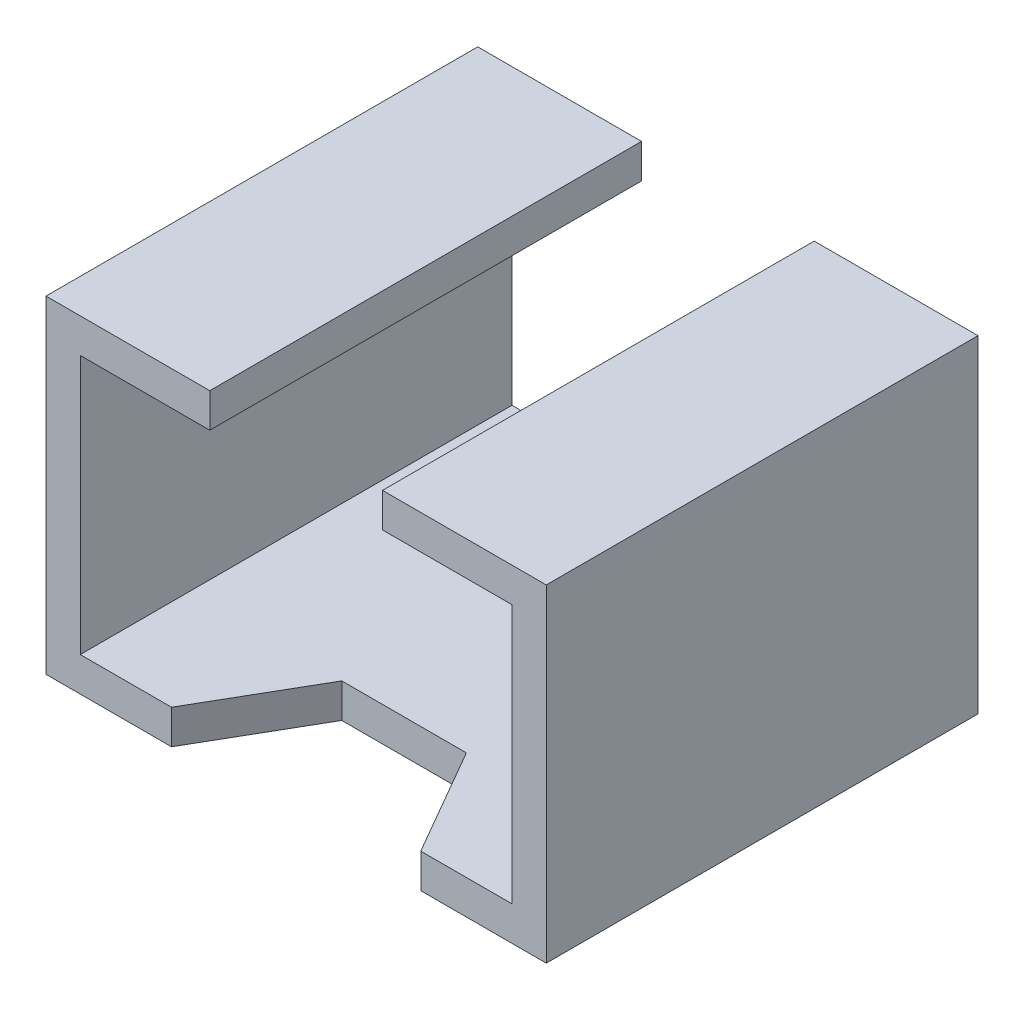
ISO-10303-21;
HEADER;
FILE_DESCRIPTION(('STEP AP214'),'2;1');
FILE_NAME('part.step','',(''),(''),'','','');
FILE_SCHEMA(('AUTOMOTIVE_DESIGN { 1 0 10303 214 1 1 1 1 }'));
ENDSEC;
DATA;
#1=APPLICATION_CONTEXT('core data for automotive mechanical design processes');
#2=APPLICATION_PROTOCOL_DEFINITION('international standard','automotive_design',2000,#1);
#3=PRODUCT_CONTEXT('',#1,'mechanical');
#4=PRODUCT('Part','Part','',(#3));
#5=PRODUCT_RELATED_PRODUCT_CATEGORY('part','',(#4));
#6=PRODUCT_DEFINITION_FORMATION('','',#4);
#7=PRODUCT_DEFINITION_CONTEXT('part definition',#1,'design');
#8=PRODUCT_DEFINITION('design','',#6,#7);
#9=PRODUCT_DEFINITION_SHAPE('','',#8);
#10=(LENGTH_UNIT() NAMED_UNIT(*) SI_UNIT(.MILLI.,.METRE.));
#11=(NAMED_UNIT(*) PLANE_ANGLE_UNIT() SI_UNIT($,.RADIAN.));
#12=(NAMED_UNIT(*) SI_UNIT($,.STERADIAN.) SOLID_ANGLE_UNIT());
#13=UNCERTAINTY_MEASURE_WITH_UNIT(LENGTH_MEASURE(1.E-05),#10,'distance_accuracy_value','');
#14=(GEOMETRIC_REPRESENTATION_CONTEXT(3) GLOBAL_UNCERTAINTY_ASSIGNED_CONTEXT((#13)) GLOBAL_UNIT_ASSIGNED_CONTEXT((#10,
#11,#12)) REPRESENTATION_CONTEXT('',''));
#15=CARTESIAN_POINT('',(0.,0.,0.));
#16=DIRECTION('',(0.,0.,1.));
#17=DIRECTION('',(1.,0.,0.));
#18=AXIS2_PLACEMENT_3D('',#15,#16,#17);
#19=CARTESIAN_POINT('',(0.,0.,50.));
#20=DIRECTION('',(0.,0.,-1.));
#21=DIRECTION('',(-1.,0.,0.));
#22=AXIS2_PLACEMENT_3D('',#19,#20,#21);
#23=PLANE('',#22);
#24=DIRECTION('',(1.,0.,0.));
#25=VECTOR('',#24,1.);
#26=CARTESIAN_POINT('',(-57.9375,-7.9375,50.));
#27=LINE('',#26,#25);
#28=CARTESIAN_POINT('',(-57.9375,-7.9375,50.));
#29=VERTEX_POINT('',#28);
#30=CARTESIAN_POINT('',(-28.8675134594813,-7.9375,50.));
#31=VERTEX_POINT('',#30);
#32=EDGE_CURVE('E303',#29,#31,#27,.T.);
#33=ORIENTED_EDGE('',*,*,#32,.T.);
#34=DIRECTION('',(0.,1.,0.));
#35=VECTOR('',#34,1.);
#36=CARTESIAN_POINT('',(-28.8675134594813,0.,50.));
#37=LINE('',#36,#35);
#38=CARTESIAN_POINT('',(-28.8675134594813,0.,50.));
#39=VERTEX_POINT('',#38);
#40=EDGE_CURVE('E257',#31,#39,#37,.T.);
#41=ORIENTED_EDGE('',*,*,#40,.T.);
#42=DIRECTION('',(-1.,0.,0.));
#43=VECTOR('',#42,1.);
#44=CARTESIAN_POINT('',(-50.,0.,50.));
#45=LINE('',#44,#43);
#46=CARTESIAN_POINT('',(-50.,0.,50.));
#47=VERTEX_POINT('',#46);
#48=EDGE_CURVE('E316',#39,#47,#45,.T.);
#49=ORIENTED_EDGE('',*,*,#48,.T.);
#50=DIRECTION('',(0.,1.,0.));
#51=VECTOR('',#50,1.);
#52=CARTESIAN_POINT('',(-50.,0.,50.));
#53=LINE('',#52,#51);
#54=CARTESIAN_POINT('',(-50.,60.,50.));
#55=VERTEX_POINT('',#54);
#56=EDGE_CURVE('E219',#47,#55,#53,.T.);
#57=ORIENTED_EDGE('',*,*,#56,.T.);
#58=DIRECTION('',(1.,0.,0.));
#59=VECTOR('',#58,1.);
#60=CARTESIAN_POINT('',(-50.,60.,50.));
#61=LINE('',#60,#59);
#62=CARTESIAN_POINT('',(-20.,60.,50.));
#63=VERTEX_POINT('',#62);
#64=EDGE_CURVE('E294',#55,#63,#61,.T.);
#65=ORIENTED_EDGE('',*,*,#64,.T.);
#66=DIRECTION('',(0.,1.,0.));
#67=VECTOR('',#66,1.);
#68=CARTESIAN_POINT('',(-20.,60.,50.));
#69=LINE('',#68,#67);
#70=CARTESIAN_POINT('',(-20.,67.9375,50.));
#71=VERTEX_POINT('',#70);
#72=EDGE_CURVE('E296',#63,#71,#69,.T.);
#73=ORIENTED_EDGE('',*,*,#72,.T.);
#74=DIRECTION('',(-1.,0.,0.));
#75=VECTOR('',#74,1.);
#76=CARTESIAN_POINT('',(-57.9375,67.9375,50.));
#77=LINE('',#76,#75);
#78=CARTESIAN_POINT('',(-57.9375,67.9375,50.));
#79=VERTEX_POINT('',#78);
#80=EDGE_CURVE('E298',#71,#79,#77,.T.);
#81=ORIENTED_EDGE('',*,*,#80,.T.);
#82=DIRECTION('',(0.,-1.,0.));
#83=VECTOR('',#82,1.);
#84=CARTESIAN_POINT('',(-57.9375,-7.9375,50.));
#85=LINE('',#84,#83);
#86=EDGE_CURVE('E300',#79,#29,#85,.T.);
#87=ORIENTED_EDGE('',*,*,#86,.T.);
#88=EDGE_LOOP('',(#33,#41,#49,#57,#65,#73,#81,#87));
#89=FACE_BOUND('',#88,.T.);
#90=ADVANCED_FACE('F33',(#89),#23,.F.);
#91=CARTESIAN_POINT('',(0.,0.,-50.));
#92=DIRECTION('',(0.,0.,-1.));
#93=DIRECTION('',(-1.,0.,0.));
#94=AXIS2_PLACEMENT_3D('',#91,#92,#93);
#95=PLANE('',#94);
#96=DIRECTION('',(0.,1.,0.));
#97=VECTOR('',#96,1.);
#98=CARTESIAN_POINT('',(-28.8675134594813,0.,-50.));
#99=LINE('',#98,#97);
#100=CARTESIAN_POINT('',(-28.8675134594813,-7.9375,-50.));
#101=VERTEX_POINT('',#100);
#102=CARTESIAN_POINT('',(-28.8675134594813,0.,-50.));
#103=VERTEX_POINT('',#102);
#104=EDGE_CURVE('E173',#101,#103,#99,.T.);
#105=ORIENTED_EDGE('',*,*,#104,.F.);
#106=DIRECTION('',(1.,0.,0.));
#107=VECTOR('',#106,1.);
#108=CARTESIAN_POINT('',(-57.9375,-7.9375,-50.));
#109=LINE('',#108,#107);
#110=CARTESIAN_POINT('',(-57.9375,-7.9375,-50.));
#111=VERTEX_POINT('',#110);
#112=EDGE_CURVE('E189',#111,#101,#109,.T.);
#113=ORIENTED_EDGE('',*,*,#112,.F.);
#114=DIRECTION('',(0.,-1.,0.));
#115=VECTOR('',#114,1.);
#116=CARTESIAN_POINT('',(-57.9375,-7.9375,-50.));
#117=LINE('',#116,#115);
#118=CARTESIAN_POINT('',(-57.9375,67.9375,-50.));
#119=VERTEX_POINT('',#118);
#120=EDGE_CURVE('E205',#119,#111,#117,.T.);
#121=ORIENTED_EDGE('',*,*,#120,.F.);
#122=DIRECTION('',(-1.,0.,0.));
#123=VECTOR('',#122,1.);
#124=CARTESIAN_POINT('',(-57.9375,67.9375,-50.));
#125=LINE('',#124,#123);
#126=CARTESIAN_POINT('',(-20.,67.9375,-50.));
#127=VERTEX_POINT('',#126);
#128=EDGE_CURVE('E323',#127,#119,#125,.T.);
#129=ORIENTED_EDGE('',*,*,#128,.F.);
#130=DIRECTION('',(0.,1.,0.));
#131=VECTOR('',#130,1.);
#132=CARTESIAN_POINT('',(-20.,60.,-50.));
#133=LINE('',#132,#131);
#134=CARTESIAN_POINT('',(-20.,60.,-50.));
#135=VERTEX_POINT('',#134);
#136=EDGE_CURVE('E322',#135,#127,#133,.T.);
#137=ORIENTED_EDGE('',*,*,#136,.F.);
#138=DIRECTION('',(1.,0.,0.));
#139=VECTOR('',#138,1.);
#140=CARTESIAN_POINT('',(-50.,60.,-50.));
#141=LINE('',#140,#139);
#142=CARTESIAN_POINT('',(-50.,60.,-50.));
#143=VERTEX_POINT('',#142);
#144=EDGE_CURVE('E320',#143,#135,#141,.T.);
#145=ORIENTED_EDGE('',*,*,#144,.F.);
#146=DIRECTION('',(0.,1.,0.));
#147=VECTOR('',#146,1.);
#148=CARTESIAN_POINT('',(-50.,0.,-50.));
#149=LINE('',#148,#147);
#150=CARTESIAN_POINT('',(-50.,0.,-50.));
#151=VERTEX_POINT('',#150);
#152=EDGE_CURVE('E291',#151,#143,#149,.T.);
#153=ORIENTED_EDGE('',*,*,#152,.F.);
#154=DIRECTION('',(-1.,0.,0.));
#155=VECTOR('',#154,1.);
#156=CARTESIAN_POINT('',(-50.,0.,-50.));
#157=LINE('',#156,#155);
#158=EDGE_CURVE('E191',#103,#151,#157,.T.);
#159=ORIENTED_EDGE('',*,*,#158,.F.);
#160=EDGE_LOOP('',(#105,#113,#121,#129,#137,#145,#153,#159));
#161=FACE_BOUND('',#160,.T.);
#162=ADVANCED_FACE('F187',(#161),#95,.T.);
#163=CARTESIAN_POINT('',(-50.,0.,50.));
#164=DIRECTION('',(-1.,0.,0.));
#165=DIRECTION('',(0.,-1.,0.));
#166=AXIS2_PLACEMENT_3D('',#163,#164,#165);
#167=PLANE('',#166);
#168=ORIENTED_EDGE('',*,*,#152,.T.);
#169=DIRECTION('',(0.,0.,-1.));
#170=VECTOR('',#169,1.);
#171=CARTESIAN_POINT('',(-50.,60.,50.));
#172=LINE('',#171,#170);
#173=EDGE_CURVE('E252',#55,#143,#172,.T.);
#174=ORIENTED_EDGE('',*,*,#173,.F.);
#175=ORIENTED_EDGE('',*,*,#56,.F.);
#176=DIRECTION('',(0.,0.,-1.));
#177=VECTOR('',#176,1.);
#178=CARTESIAN_POINT('',(-50.,0.,50.));
#179=LINE('',#178,#177);
#180=EDGE_CURVE('E220',#47,#151,#179,.T.);
#181=ORIENTED_EDGE('',*,*,#180,.T.);
#182=EDGE_LOOP('',(#168,#174,#175,#181));
#183=FACE_BOUND('',#182,.T.);
#184=ADVANCED_FACE('F35',(#183),#167,.F.);
#185=CARTESIAN_POINT('',(-50.,60.,50.));
#186=DIRECTION('',(0.,1.,0.));
#187=DIRECTION('',(0.,0.,1.));
#188=AXIS2_PLACEMENT_3D('',#185,#186,#187);
#189=PLANE('',#188);
#190=ORIENTED_EDGE('',*,*,#144,.T.);
#191=DIRECTION('',(0.,0.,-1.));
#192=VECTOR('',#191,1.);
#193=CARTESIAN_POINT('',(-20.,60.,50.));
#194=LINE('',#193,#192);
#195=EDGE_CURVE('E249',#63,#135,#194,.T.);
#196=ORIENTED_EDGE('',*,*,#195,.F.);
#197=ORIENTED_EDGE('',*,*,#64,.F.);
#198=ORIENTED_EDGE('',*,*,#173,.T.);
#199=EDGE_LOOP('',(#190,#196,#197,#198));
#200=FACE_BOUND('',#199,.T.);
#201=ADVANCED_FACE('F342',(#200),#189,.F.);
#202=CARTESIAN_POINT('',(-20.,60.,50.));
#203=DIRECTION('',(-1.,0.,0.));
#204=DIRECTION('',(0.,-1.,0.));
#205=AXIS2_PLACEMENT_3D('',#202,#203,#204);
#206=PLANE('',#205);
#207=ORIENTED_EDGE('',*,*,#136,.T.);
#208=DIRECTION('',(0.,0.,-1.));
#209=VECTOR('',#208,1.);
#210=CARTESIAN_POINT('',(-20.,67.9375,50.));
#211=LINE('',#210,#209);
#212=EDGE_CURVE('E246',#71,#127,#211,.T.);
#213=ORIENTED_EDGE('',*,*,#212,.F.);
#214=ORIENTED_EDGE('',*,*,#72,.F.);
#215=ORIENTED_EDGE('',*,*,#195,.T.);
#216=EDGE_LOOP('',(#207,#213,#214,#215));
#217=FACE_BOUND('',#216,.T.);
#218=ADVANCED_FACE('F333',(#217),#206,.F.);
#219=CARTESIAN_POINT('',(-57.9375,67.9375,50.));
#220=DIRECTION('',(0.,-1.,0.));
#221=DIRECTION('',(0.,0.,-1.));
#222=AXIS2_PLACEMENT_3D('',#219,#220,#221);
#223=PLANE('',#222);
#224=ORIENTED_EDGE('',*,*,#128,.T.);
#225=DIRECTION('',(0.,0.,-1.));
#226=VECTOR('',#225,1.);
#227=CARTESIAN_POINT('',(-57.9375,67.9375,50.));
#228=LINE('',#227,#226);
#229=EDGE_CURVE('E243',#79,#119,#228,.T.);
#230=ORIENTED_EDGE('',*,*,#229,.F.);
#231=ORIENTED_EDGE('',*,*,#80,.F.);
#232=ORIENTED_EDGE('',*,*,#212,.T.);
#233=EDGE_LOOP('',(#224,#230,#231,#232));
#234=FACE_BOUND('',#233,.T.);
#235=ADVANCED_FACE('F337',(#234),#223,.F.);
#236=CARTESIAN_POINT('',(-57.9375,-7.9375,50.));
#237=DIRECTION('',(1.,0.,0.));
#238=DIRECTION('',(0.,0.,-1.));
#239=AXIS2_PLACEMENT_3D('',#236,#237,#238);
#240=PLANE('',#239);
#241=ORIENTED_EDGE('',*,*,#120,.T.);
#242=DIRECTION('',(0.,0.,-1.));
#243=VECTOR('',#242,1.);
#244=CARTESIAN_POINT('',(-57.9375,-7.9375,50.));
#245=LINE('',#244,#243);
#246=EDGE_CURVE('E199',#29,#111,#245,.T.);
#247=ORIENTED_EDGE('',*,*,#246,.F.);
#248=ORIENTED_EDGE('',*,*,#86,.F.);
#249=ORIENTED_EDGE('',*,*,#229,.T.);
#250=EDGE_LOOP('',(#241,#247,#248,#249));
#251=FACE_BOUND('',#250,.T.);
#252=ADVANCED_FACE('F328',(#251),#240,.F.);
#253=CARTESIAN_POINT('',(-57.9375,-7.9375,50.));
#254=DIRECTION('',(0.,1.,0.));
#255=DIRECTION('',(0.,0.,1.));
#256=AXIS2_PLACEMENT_3D('',#253,#254,#255);
#257=PLANE('',#256);
#258=ORIENTED_EDGE('',*,*,#112,.T.);
#259=DIRECTION('',(-0.5,0.,-0.866025403784439));
#260=VECTOR('',#259,1.);
#261=CARTESIAN_POINT('',(-14.4337567297406,-7.9375,-25.));
#262=LINE('',#261,#260);
#263=CARTESIAN_POINT('',(-14.4337567297406,-7.9375,-25.));
#264=VERTEX_POINT('',#263);
#265=EDGE_CURVE('E170',#264,#101,#262,.T.);
#266=ORIENTED_EDGE('',*,*,#265,.F.);
#267=DIRECTION('',(-1.,0.,0.));
#268=VECTOR('',#267,1.);
#269=CARTESIAN_POINT('',(14.4337567297406,-7.9375,-25.));
#270=LINE('',#269,#268);
#271=CARTESIAN_POINT('',(14.4337567297406,-7.9375,-25.));
#272=VERTEX_POINT('',#271);
#273=EDGE_CURVE('E347',#272,#264,#270,.T.);
#274=ORIENTED_EDGE('',*,*,#273,.F.);
#275=DIRECTION('',(-0.5,0.,0.866025403784438));
#276=VECTOR('',#275,1.);
#277=CARTESIAN_POINT('',(28.8675134594813,-7.9375,-50.));
#278=LINE('',#277,#276);
#279=CARTESIAN_POINT('',(28.8675134594813,-7.9375,-50.));
#280=VERTEX_POINT('',#279);
#281=EDGE_CURVE('E181',#280,#272,#278,.T.);
#282=ORIENTED_EDGE('',*,*,#281,.F.);
#283=CARTESIAN_POINT('',(57.9375,-7.9375,-50.));
#284=VERTEX_POINT('',#283);
#285=EDGE_CURVE('E201',#280,#284,#109,.T.);
#286=ORIENTED_EDGE('',*,*,#285,.T.);
#287=DIRECTION('',(0.,0.,-1.));
#288=VECTOR('',#287,1.);
#289=CARTESIAN_POINT('',(57.9375,-7.9375,50.));
#290=LINE('',#289,#288);
#291=CARTESIAN_POINT('',(57.9375,-7.9375,50.));
#292=VERTEX_POINT('',#291);
#293=EDGE_CURVE('E239',#292,#284,#290,.T.);
#294=ORIENTED_EDGE('',*,*,#293,.F.);
#295=CARTESIAN_POINT('',(28.8675134594813,-7.9375,50.));
#296=VERTEX_POINT('',#295);
#297=EDGE_CURVE('E302',#296,#292,#27,.T.);
#298=ORIENTED_EDGE('',*,*,#297,.F.);
#299=DIRECTION('',(0.5,0.,0.866025403784438));
#300=VECTOR('',#299,1.);
#301=CARTESIAN_POINT('',(28.8675134594813,-7.9375,50.));
#302=LINE('',#301,#300);
#303=CARTESIAN_POINT('',(14.4337567297406,-7.9375,25.));
#304=VERTEX_POINT('',#303);
#305=EDGE_CURVE('E48',#304,#296,#302,.T.);
#306=ORIENTED_EDGE('',*,*,#305,.F.);
#307=DIRECTION('',(1.,0.,0.));
#308=VECTOR('',#307,1.);
#309=CARTESIAN_POINT('',(14.4337567297406,-7.9375,25.));
#310=LINE('',#309,#308);
#311=CARTESIAN_POINT('',(-14.4337567297406,-7.9375,25.));
#312=VERTEX_POINT('',#311);
#313=EDGE_CURVE('E283',#312,#304,#310,.T.);
#314=ORIENTED_EDGE('',*,*,#313,.F.);
#315=DIRECTION('',(0.5,0.,-0.866025403784439));
#316=VECTOR('',#315,1.);
#317=CARTESIAN_POINT('',(-14.4337567297406,-7.9375,25.));
#318=LINE('',#317,#316);
#319=EDGE_CURVE('E279',#31,#312,#318,.T.);
#320=ORIENTED_EDGE('',*,*,#319,.F.);
#321=ORIENTED_EDGE('',*,*,#32,.F.);
#322=ORIENTED_EDGE('',*,*,#246,.T.);
#323=EDGE_LOOP('',(#258,#266,#274,#282,#286,#294,#298,#306,#314,#320,#321,#322));
#324=FACE_BOUND('',#323,.T.);
#325=ADVANCED_FACE('F196',(#324),#257,.F.);
#326=CARTESIAN_POINT('',(57.9375,-7.9375,50.));
#327=DIRECTION('',(-1.,0.,0.));
#328=DIRECTION('',(0.,0.,1.));
#329=AXIS2_PLACEMENT_3D('',#326,#327,#328);
#330=PLANE('',#329);
#331=DIRECTION('',(0.,1.,0.));
#332=VECTOR('',#331,1.);
#333=CARTESIAN_POINT('',(57.9375,-7.9375,-50.));
#334=LINE('',#333,#332);
#335=CARTESIAN_POINT('',(57.9375,67.9375,-50.));
#336=VERTEX_POINT('',#335);
#337=EDGE_CURVE('E200',#284,#336,#334,.T.);
#338=ORIENTED_EDGE('',*,*,#337,.T.);
#339=DIRECTION('',(0.,0.,-1.));
#340=VECTOR('',#339,1.);
#341=CARTESIAN_POINT('',(57.9375,67.9375,50.));
#342=LINE('',#341,#340);
#343=CARTESIAN_POINT('',(57.9375,67.9375,50.));
#344=VERTEX_POINT('',#343);
#345=EDGE_CURVE('E236',#344,#336,#342,.T.);
#346=ORIENTED_EDGE('',*,*,#345,.F.);
#347=DIRECTION('',(0.,1.,0.));
#348=VECTOR('',#347,1.);
#349=CARTESIAN_POINT('',(57.9375,-7.9375,50.));
#350=LINE('',#349,#348);
#351=EDGE_CURVE('E306',#292,#344,#350,.T.);
#352=ORIENTED_EDGE('',*,*,#351,.F.);
#353=ORIENTED_EDGE('',*,*,#293,.T.);
#354=EDGE_LOOP('',(#338,#346,#352,#353));
#355=FACE_BOUND('',#354,.T.);
#356=ADVANCED_FACE('F402',(#355),#330,.F.);
#357=CARTESIAN_POINT('',(57.9375,67.9375,50.));
#358=DIRECTION('',(0.,-1.,0.));
#359=DIRECTION('',(1.,0.,0.));
#360=AXIS2_PLACEMENT_3D('',#357,#358,#359);
#361=PLANE('',#360);
#362=DIRECTION('',(-1.,0.,0.));
#363=VECTOR('',#362,1.);
#364=CARTESIAN_POINT('',(57.9375,67.9375,-50.));
#365=LINE('',#364,#363);
#366=CARTESIAN_POINT('',(20.,67.9375,-50.));
#367=VERTEX_POINT('',#366);
#368=EDGE_CURVE('E203',#336,#367,#365,.T.);
#369=ORIENTED_EDGE('',*,*,#368,.T.);
#370=DIRECTION('',(0.,0.,-1.));
#371=VECTOR('',#370,1.);
#372=CARTESIAN_POINT('',(20.,67.9375,50.));
#373=LINE('',#372,#371);
#374=CARTESIAN_POINT('',(20.,67.9375,50.));
#375=VERTEX_POINT('',#374);
#376=EDGE_CURVE('E233',#375,#367,#373,.T.);
#377=ORIENTED_EDGE('',*,*,#376,.F.);
#378=DIRECTION('',(-1.,0.,0.));
#379=VECTOR('',#378,1.);
#380=CARTESIAN_POINT('',(57.9375,67.9375,50.));
#381=LINE('',#380,#379);
#382=EDGE_CURVE('E308',#344,#375,#381,.T.);
#383=ORIENTED_EDGE('',*,*,#382,.F.);
#384=ORIENTED_EDGE('',*,*,#345,.T.);
#385=EDGE_LOOP('',(#369,#377,#383,#384));
#386=FACE_BOUND('',#385,.T.);
#387=ADVANCED_FACE('F398',(#386),#361,.F.);
#388=CARTESIAN_POINT('',(20.,60.,50.));
#389=DIRECTION('',(1.,0.,0.));
#390=DIRECTION('',(0.,0.,-1.));
#391=AXIS2_PLACEMENT_3D('',#388,#389,#390);
#392=PLANE('',#391);
#393=DIRECTION('',(0.,-1.,0.));
#394=VECTOR('',#393,1.);
#395=CARTESIAN_POINT('',(20.,60.,-50.));
#396=LINE('',#395,#394);
#397=CARTESIAN_POINT('',(20.,60.,-50.));
#398=VERTEX_POINT('',#397);
#399=EDGE_CURVE('E210',#367,#398,#396,.T.);
#400=ORIENTED_EDGE('',*,*,#399,.T.);
#401=DIRECTION('',(0.,0.,-1.));
#402=VECTOR('',#401,1.);
#403=CARTESIAN_POINT('',(20.,60.,50.));
#404=LINE('',#403,#402);
#405=CARTESIAN_POINT('',(20.,60.,50.));
#406=VERTEX_POINT('',#405);
#407=EDGE_CURVE('E230',#406,#398,#404,.T.);
#408=ORIENTED_EDGE('',*,*,#407,.F.);
#409=DIRECTION('',(0.,-1.,0.));
#410=VECTOR('',#409,1.);
#411=CARTESIAN_POINT('',(20.,60.,50.));
#412=LINE('',#411,#410);
#413=EDGE_CURVE('E310',#375,#406,#412,.T.);
#414=ORIENTED_EDGE('',*,*,#413,.F.);
#415=ORIENTED_EDGE('',*,*,#376,.T.);
#416=EDGE_LOOP('',(#400,#408,#414,#415));
#417=FACE_BOUND('',#416,.T.);
#418=ADVANCED_FACE('F394',(#417),#392,.F.);
#419=CARTESIAN_POINT('',(50.,60.,50.));
#420=DIRECTION('',(0.,1.,0.));
#421=DIRECTION('',(0.,0.,1.));
#422=AXIS2_PLACEMENT_3D('',#419,#420,#421);
#423=PLANE('',#422);
#424=DIRECTION('',(1.,0.,0.));
#425=VECTOR('',#424,1.);
#426=CARTESIAN_POINT('',(50.,60.,-50.));
#427=LINE('',#426,#425);
#428=CARTESIAN_POINT('',(50.,60.,-50.));
#429=VERTEX_POINT('',#428);
#430=EDGE_CURVE('E212',#398,#429,#427,.T.);
#431=ORIENTED_EDGE('',*,*,#430,.T.);
#432=DIRECTION('',(0.,0.,-1.));
#433=VECTOR('',#432,1.);
#434=CARTESIAN_POINT('',(50.,60.,50.));
#435=LINE('',#434,#433);
#436=CARTESIAN_POINT('',(50.,60.,50.));
#437=VERTEX_POINT('',#436);
#438=EDGE_CURVE('E227',#437,#429,#435,.T.);
#439=ORIENTED_EDGE('',*,*,#438,.F.);
#440=DIRECTION('',(1.,0.,0.));
#441=VECTOR('',#440,1.);
#442=CARTESIAN_POINT('',(50.,60.,50.));
#443=LINE('',#442,#441);
#444=EDGE_CURVE('E312',#406,#437,#443,.T.);
#445=ORIENTED_EDGE('',*,*,#444,.F.);
#446=ORIENTED_EDGE('',*,*,#407,.T.);
#447=EDGE_LOOP('',(#431,#439,#445,#446));
#448=FACE_BOUND('',#447,.T.);
#449=ADVANCED_FACE('F388',(#448),#423,.F.);
#450=CARTESIAN_POINT('',(50.,0.,50.));
#451=DIRECTION('',(1.,0.,0.));
#452=DIRECTION('',(0.,1.,0.));
#453=AXIS2_PLACEMENT_3D('',#450,#451,#452);
#454=PLANE('',#453);
#455=DIRECTION('',(0.,-1.,0.));
#456=VECTOR('',#455,1.);
#457=CARTESIAN_POINT('',(50.,0.,-50.));
#458=LINE('',#457,#456);
#459=CARTESIAN_POINT('',(50.,0.,-50.));
#460=VERTEX_POINT('',#459);
#461=EDGE_CURVE('E214',#429,#460,#458,.T.);
#462=ORIENTED_EDGE('',*,*,#461,.T.);
#463=DIRECTION('',(0.,0.,-1.));
#464=VECTOR('',#463,1.);
#465=CARTESIAN_POINT('',(50.,0.,50.));
#466=LINE('',#465,#464);
#467=CARTESIAN_POINT('',(50.,0.,50.));
#468=VERTEX_POINT('',#467);
#469=EDGE_CURVE('E223',#468,#460,#466,.T.);
#470=ORIENTED_EDGE('',*,*,#469,.F.);
#471=DIRECTION('',(0.,-1.,0.));
#472=VECTOR('',#471,1.);
#473=CARTESIAN_POINT('',(50.,0.,50.));
#474=LINE('',#473,#472);
#475=EDGE_CURVE('E314',#437,#468,#474,.T.);
#476=ORIENTED_EDGE('',*,*,#475,.F.);
#477=ORIENTED_EDGE('',*,*,#438,.T.);
#478=EDGE_LOOP('',(#462,#470,#476,#477));
#479=FACE_BOUND('',#478,.T.);
#480=ADVANCED_FACE('F383',(#479),#454,.F.);
#481=CARTESIAN_POINT('',(-50.,0.,50.));
#482=DIRECTION('',(0.,-1.,0.));
#483=DIRECTION('',(0.,0.,-1.));
#484=AXIS2_PLACEMENT_3D('',#481,#482,#483);
#485=PLANE('',#484);
#486=DIRECTION('',(-1.,0.,0.));
#487=VECTOR('',#486,1.);
#488=CARTESIAN_POINT('',(-50.,0.,-25.));
#489=LINE('',#488,#487);
#490=CARTESIAN_POINT('',(14.4337567297406,0.,-25.));
#491=VERTEX_POINT('',#490);
#492=CARTESIAN_POINT('',(-14.4337567297406,0.,-25.));
#493=VERTEX_POINT('',#492);
#494=EDGE_CURVE('E11',#491,#493,#489,.T.);
#495=ORIENTED_EDGE('',*,*,#494,.T.);
#496=DIRECTION('',(-0.5,0.,-0.866025403784439));
#497=VECTOR('',#496,1.);
#498=CARTESIAN_POINT('',(9.15063509461097,0.,15.849364905389));
#499=LINE('',#498,#497);
#500=EDGE_CURVE('E287',#493,#103,#499,.T.);
#501=ORIENTED_EDGE('',*,*,#500,.T.);
#502=ORIENTED_EDGE('',*,*,#158,.T.);
#503=ORIENTED_EDGE('',*,*,#180,.F.);
#504=ORIENTED_EDGE('',*,*,#48,.F.);
#505=DIRECTION('',(0.5,0.,-0.866025403784439));
#506=VECTOR('',#505,1.);
#507=CARTESIAN_POINT('',(-34.150635094611,0.,59.150635094611));
#508=LINE('',#507,#506);
#509=CARTESIAN_POINT('',(-14.4337567297406,0.,25.));
#510=VERTEX_POINT('',#509);
#511=EDGE_CURVE('E268',#39,#510,#508,.T.);
#512=ORIENTED_EDGE('',*,*,#511,.T.);
#513=DIRECTION('',(1.,0.,0.));
#514=VECTOR('',#513,1.);
#515=CARTESIAN_POINT('',(-50.,0.,25.));
#516=LINE('',#515,#514);
#517=CARTESIAN_POINT('',(14.4337567297406,0.,25.));
#518=VERTEX_POINT('',#517);
#519=EDGE_CURVE('E41',#510,#518,#516,.T.);
#520=ORIENTED_EDGE('',*,*,#519,.T.);
#521=DIRECTION('',(0.5,0.,0.866025403784439));
#522=VECTOR('',#521,1.);
#523=CARTESIAN_POINT('',(9.15063509461096,0.,15.849364905389));
#524=LINE('',#523,#522);
#525=CARTESIAN_POINT('',(28.8675134594813,0.,50.));
#526=VERTEX_POINT('',#525);
#527=EDGE_CURVE('E265',#518,#526,#524,.T.);
#528=ORIENTED_EDGE('',*,*,#527,.T.);
#529=EDGE_CURVE('E224',#468,#526,#45,.T.);
#530=ORIENTED_EDGE('',*,*,#529,.F.);
#531=ORIENTED_EDGE('',*,*,#469,.T.);
#532=CARTESIAN_POINT('',(28.8675134594813,0.,-50.));
#533=VERTEX_POINT('',#532);
#534=EDGE_CURVE('E216',#460,#533,#157,.T.);
#535=ORIENTED_EDGE('',*,*,#534,.T.);
#536=DIRECTION('',(-0.5,0.,0.866025403784439));
#537=VECTOR('',#536,1.);
#538=CARTESIAN_POINT('',(-34.150635094611,0.,59.1506350946109));
#539=LINE('',#538,#537);
#540=EDGE_CURVE('E56',#533,#491,#539,.T.);
#541=ORIENTED_EDGE('',*,*,#540,.T.);
#542=EDGE_LOOP('',(#495,#501,#502,#503,#504,#512,#520,#528,#530,#531,#535,#541));
#543=FACE_BOUND('',#542,.T.);
#544=ADVANCED_FACE('F263',(#543),#485,.F.);
#545=ORIENTED_EDGE('',*,*,#529,.T.);
#546=DIRECTION('',(0.,-1.,0.));
#547=VECTOR('',#546,1.);
#548=CARTESIAN_POINT('',(28.8675134594813,0.,50.));
#549=LINE('',#548,#547);
#550=EDGE_CURVE('E192',#526,#296,#549,.T.);
#551=ORIENTED_EDGE('',*,*,#550,.T.);
#552=ORIENTED_EDGE('',*,*,#297,.T.);
#553=ORIENTED_EDGE('',*,*,#351,.T.);
#554=ORIENTED_EDGE('',*,*,#382,.T.);
#555=ORIENTED_EDGE('',*,*,#413,.T.);
#556=ORIENTED_EDGE('',*,*,#444,.T.);
#557=ORIENTED_EDGE('',*,*,#475,.T.);
#558=EDGE_LOOP('',(#545,#551,#552,#553,#554,#555,#556,#557));
#559=FACE_BOUND('',#558,.T.);
#560=ADVANCED_FACE('F359',(#559),#23,.F.);
#561=DIRECTION('',(0.,-1.,0.));
#562=VECTOR('',#561,1.);
#563=CARTESIAN_POINT('',(28.8675134594813,0.,-50.));
#564=LINE('',#563,#562);
#565=EDGE_CURVE('E193',#533,#280,#564,.T.);
#566=ORIENTED_EDGE('',*,*,#565,.F.);
#567=ORIENTED_EDGE('',*,*,#534,.F.);
#568=ORIENTED_EDGE('',*,*,#461,.F.);
#569=ORIENTED_EDGE('',*,*,#430,.F.);
#570=ORIENTED_EDGE('',*,*,#399,.F.);
#571=ORIENTED_EDGE('',*,*,#368,.F.);
#572=ORIENTED_EDGE('',*,*,#337,.F.);
#573=ORIENTED_EDGE('',*,*,#285,.F.);
#574=EDGE_LOOP('',(#566,#567,#568,#569,#570,#571,#572,#573));
#575=FACE_BOUND('',#574,.T.);
#576=ADVANCED_FACE('F376',(#575),#95,.T.);
#577=CARTESIAN_POINT('',(14.4337567297406,2.0625,-25.));
#578=DIRECTION('',(0.,0.,1.));
#579=DIRECTION('',(1.,0.,0.));
#580=AXIS2_PLACEMENT_3D('',#577,#578,#579);
#581=PLANE('',#580);
#582=DIRECTION('',(0.,-1.,0.));
#583=VECTOR('',#582,1.);
#584=CARTESIAN_POINT('',(14.4337567297406,2.0625,-25.));
#585=LINE('',#584,#583);
#586=EDGE_CURVE('E348',#491,#272,#585,.T.);
#587=ORIENTED_EDGE('',*,*,#586,.T.);
#588=ORIENTED_EDGE('',*,*,#273,.T.);
#589=DIRECTION('',(0.,-1.,0.));
#590=VECTOR('',#589,1.);
#591=CARTESIAN_POINT('',(-14.4337567297406,2.0625,-25.));
#592=LINE('',#591,#590);
#593=EDGE_CURVE('E176',#493,#264,#592,.T.);
#594=ORIENTED_EDGE('',*,*,#593,.F.);
#595=ORIENTED_EDGE('',*,*,#494,.F.);
#596=EDGE_LOOP('',(#587,#588,#594,#595));
#597=FACE_BOUND('',#596,.T.);
#598=ADVANCED_FACE('F346',(#597),#581,.F.);
#599=CARTESIAN_POINT('',(-14.4337567297406,2.0625,-25.));
#600=DIRECTION('',(-0.866025403784439,0.,0.5));
#601=DIRECTION('',(0.5,0.,0.866025403784439));
#602=AXIS2_PLACEMENT_3D('',#599,#600,#601);
#603=PLANE('',#602);
#604=ORIENTED_EDGE('',*,*,#593,.T.);
#605=ORIENTED_EDGE('',*,*,#265,.T.);
#606=ORIENTED_EDGE('',*,*,#104,.T.);
#607=ORIENTED_EDGE('',*,*,#500,.F.);
#608=EDGE_LOOP('',(#604,#605,#606,#607));
#609=FACE_BOUND('',#608,.T.);
#610=ADVANCED_FACE('F172',(#609),#603,.F.);
#611=CARTESIAN_POINT('',(28.8675134594813,2.0625,-50.));
#612=DIRECTION('',(0.866025403784438,0.,0.5));
#613=DIRECTION('',(0.5,0.,-0.866025403784439));
#614=AXIS2_PLACEMENT_3D('',#611,#612,#613);
#615=PLANE('',#614);
#616=ORIENTED_EDGE('',*,*,#565,.T.);
#617=ORIENTED_EDGE('',*,*,#281,.T.);
#618=ORIENTED_EDGE('',*,*,#586,.F.);
#619=ORIENTED_EDGE('',*,*,#540,.F.);
#620=EDGE_LOOP('',(#616,#617,#618,#619));
#621=FACE_BOUND('',#620,.T.);
#622=ADVANCED_FACE('F467',(#621),#615,.F.);
#623=CARTESIAN_POINT('',(14.4337567297406,2.0625,25.));
#624=DIRECTION('',(0.,0.,-1.));
#625=DIRECTION('',(-1.,0.,0.));
#626=AXIS2_PLACEMENT_3D('',#623,#624,#625);
#627=PLANE('',#626);
#628=DIRECTION('',(0.,-1.,0.));
#629=VECTOR('',#628,1.);
#630=CARTESIAN_POINT('',(-14.4337567297406,2.0625,25.));
#631=LINE('',#630,#629);
#632=EDGE_CURVE('E274',#510,#312,#631,.T.);
#633=ORIENTED_EDGE('',*,*,#632,.T.);
#634=ORIENTED_EDGE('',*,*,#313,.T.);
#635=DIRECTION('',(0.,-1.,0.));
#636=VECTOR('',#635,1.);
#637=CARTESIAN_POINT('',(14.4337567297406,2.0625,25.));
#638=LINE('',#637,#636);
#639=EDGE_CURVE('E182',#518,#304,#638,.T.);
#640=ORIENTED_EDGE('',*,*,#639,.F.);
#641=ORIENTED_EDGE('',*,*,#519,.F.);
#642=EDGE_LOOP('',(#633,#634,#640,#641));
#643=FACE_BOUND('',#642,.T.);
#644=ADVANCED_FACE('F272',(#643),#627,.F.);
#645=CARTESIAN_POINT('',(-14.4337567297406,2.0625,25.));
#646=DIRECTION('',(-0.866025403784439,0.,-0.5));
#647=DIRECTION('',(-0.5,0.,0.866025403784439));
#648=AXIS2_PLACEMENT_3D('',#645,#646,#647);
#649=PLANE('',#648);
#650=ORIENTED_EDGE('',*,*,#40,.F.);
#651=ORIENTED_EDGE('',*,*,#319,.T.);
#652=ORIENTED_EDGE('',*,*,#632,.F.);
#653=ORIENTED_EDGE('',*,*,#511,.F.);
#654=EDGE_LOOP('',(#650,#651,#652,#653));
#655=FACE_BOUND('',#654,.T.);
#656=ADVANCED_FACE('F277',(#655),#649,.F.);
#657=CARTESIAN_POINT('',(28.8675134594813,2.0625,50.));
#658=DIRECTION('',(0.866025403784438,0.,-0.5));
#659=DIRECTION('',(-0.5,0.,-0.866025403784439));
#660=AXIS2_PLACEMENT_3D('',#657,#658,#659);
#661=PLANE('',#660);
#662=ORIENTED_EDGE('',*,*,#639,.T.);
#663=ORIENTED_EDGE('',*,*,#305,.T.);
#664=ORIENTED_EDGE('',*,*,#550,.F.);
#665=ORIENTED_EDGE('',*,*,#527,.F.);
#666=EDGE_LOOP('',(#662,#663,#664,#665));
#667=FACE_BOUND('',#666,.T.);
#668=ADVANCED_FACE('F361',(#667),#661,.F.);
#669=CLOSED_SHELL('',(#90,#162,#184,#201,#218,#235,#252,#325,#356,#387,#418,#449,#480,#544,#560,
#576,#598,#610,#622,#644,#656,#668));
#670=MANIFOLD_SOLID_BREP('B2',#669);
#671=ADVANCED_BREP_SHAPE_REPRESENTATION('',(#18,#670),#14);
#672=SHAPE_DEFINITION_REPRESENTATION(#9,#671);
ENDSEC;
END-ISO-10303-21;
